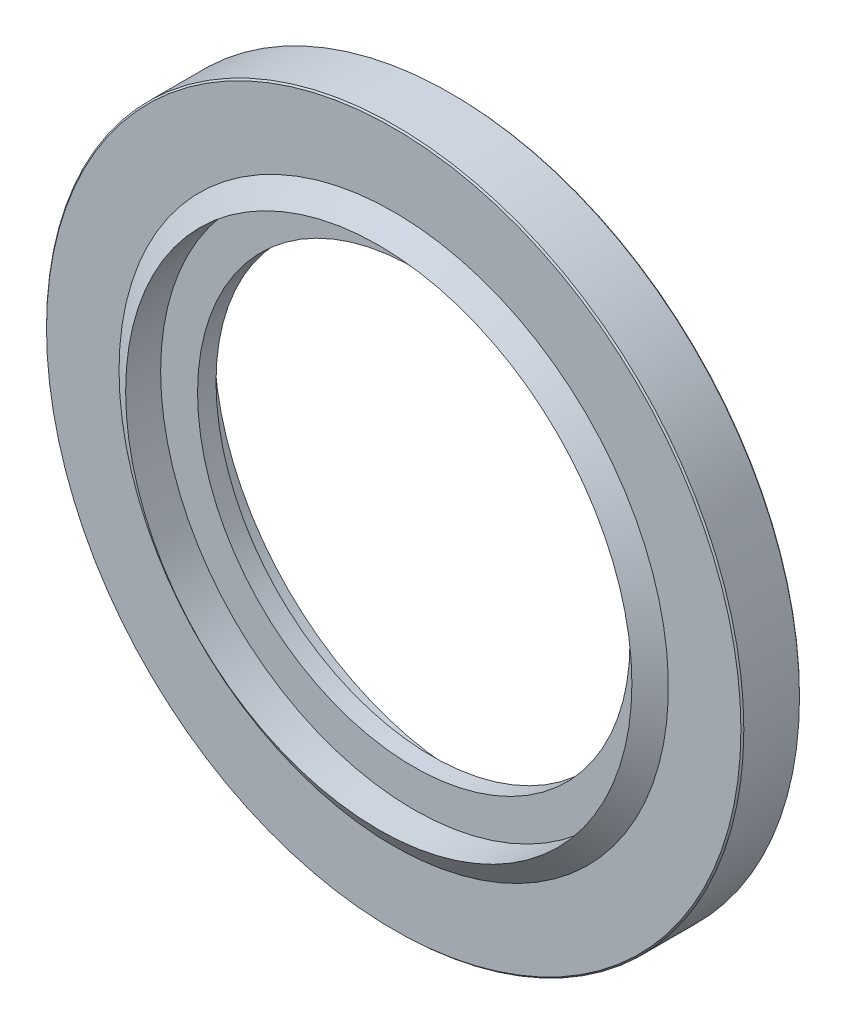
ISO-10303-21;
HEADER;
FILE_DESCRIPTION(('STEP AP214'),'2;1');
FILE_NAME('part.step','',(''),(''),'','','');
FILE_SCHEMA(('AUTOMOTIVE_DESIGN { 1 0 10303 214 1 1 1 1 }'));
ENDSEC;
DATA;
#1=APPLICATION_CONTEXT('core data for automotive mechanical design processes');
#2=APPLICATION_PROTOCOL_DEFINITION('international standard','automotive_design',2000,#1);
#3=PRODUCT_CONTEXT('',#1,'mechanical');
#4=PRODUCT('Part','Part','',(#3));
#5=PRODUCT_RELATED_PRODUCT_CATEGORY('part','',(#4));
#6=PRODUCT_DEFINITION_FORMATION('','',#4);
#7=PRODUCT_DEFINITION_CONTEXT('part definition',#1,'design');
#8=PRODUCT_DEFINITION('design','',#6,#7);
#9=PRODUCT_DEFINITION_SHAPE('','',#8);
#10=(LENGTH_UNIT() NAMED_UNIT(*) SI_UNIT(.MILLI.,.METRE.));
#11=(NAMED_UNIT(*) PLANE_ANGLE_UNIT() SI_UNIT($,.RADIAN.));
#12=(NAMED_UNIT(*) SI_UNIT($,.STERADIAN.) SOLID_ANGLE_UNIT());
#13=UNCERTAINTY_MEASURE_WITH_UNIT(LENGTH_MEASURE(1.E-05),#10,'distance_accuracy_value','');
#14=(GEOMETRIC_REPRESENTATION_CONTEXT(3) GLOBAL_UNCERTAINTY_ASSIGNED_CONTEXT((#13)) GLOBAL_UNIT_ASSIGNED_CONTEXT((#10,
#11,#12)) REPRESENTATION_CONTEXT('',''));
#15=CARTESIAN_POINT('',(0.,0.,0.));
#16=DIRECTION('',(0.,0.,1.));
#17=DIRECTION('',(1.,0.,0.));
#18=AXIS2_PLACEMENT_3D('',#15,#16,#17);
#19=CARTESIAN_POINT('',(0.,8.64,0.314999999999996));
#20=DIRECTION('',(0.,0.,-1.));
#21=DIRECTION('',(0.,-1.,0.));
#22=AXIS2_PLACEMENT_3D('',#19,#20,#21);
#23=PLANE('',#22);
#24=CARTESIAN_POINT('',(0.,0.,0.315));
#25=DIRECTION('',(0.,0.,1.));
#26=DIRECTION('',(1.,0.,0.));
#27=AXIS2_PLACEMENT_3D('',#24,#25,#26);
#28=CIRCLE('',#27,7.38);
#29=CARTESIAN_POINT('',(7.38,0.,0.315));
#30=VERTEX_POINT('',#29);
#31=EDGE_CURVE('E107',#30,#30,#28,.T.);
#32=ORIENTED_EDGE('',*,*,#31,.F.);
#33=EDGE_LOOP('',(#32));
#34=FACE_BOUND('',#33,.T.);
#35=CARTESIAN_POINT('',(0.,0.,0.314999999999994));
#36=DIRECTION('',(0.,0.,1.));
#37=DIRECTION('',(1.,0.,0.));
#38=AXIS2_PLACEMENT_3D('',#35,#36,#37);
#39=CIRCLE('',#38,8.64);
#40=CARTESIAN_POINT('',(8.64,0.,0.314999999999994));
#41=VERTEX_POINT('',#40);
#42=EDGE_CURVE('E112',#41,#41,#39,.T.);
#43=ORIENTED_EDGE('',*,*,#42,.T.);
#44=EDGE_LOOP('',(#43));
#45=FACE_BOUND('',#44,.T.);
#46=ADVANCED_FACE('F17',(#34,#45),#23,.F.);
#47=CARTESIAN_POINT('',(0.,8.64,-0.315000000000004));
#48=DIRECTION('',(0.,0.,1.));
#49=DIRECTION('',(1.,0.,0.));
#50=AXIS2_PLACEMENT_3D('',#47,#48,#49);
#51=PLANE('',#50);
#52=CARTESIAN_POINT('',(0.,0.,-0.315));
#53=DIRECTION('',(0.,0.,1.));
#54=DIRECTION('',(1.,0.,0.));
#55=AXIS2_PLACEMENT_3D('',#52,#53,#54);
#56=CIRCLE('',#55,7.38);
#57=CARTESIAN_POINT('',(7.38,0.,-0.315));
#58=VERTEX_POINT('',#57);
#59=EDGE_CURVE('E114',#58,#58,#56,.T.);
#60=ORIENTED_EDGE('',*,*,#59,.T.);
#61=EDGE_LOOP('',(#60));
#62=FACE_BOUND('',#61,.T.);
#63=CARTESIAN_POINT('',(0.,0.,-0.315000000000006));
#64=DIRECTION('',(0.,0.,1.));
#65=DIRECTION('',(1.,0.,0.));
#66=AXIS2_PLACEMENT_3D('',#63,#64,#65);
#67=CIRCLE('',#66,8.64);
#68=CARTESIAN_POINT('',(8.64,0.,-0.315000000000006));
#69=VERTEX_POINT('',#68);
#70=EDGE_CURVE('E100',#69,#69,#67,.T.);
#71=ORIENTED_EDGE('',*,*,#70,.F.);
#72=EDGE_LOOP('',(#71));
#73=FACE_BOUND('',#72,.T.);
#74=ADVANCED_FACE('F144',(#62,#73),#51,.F.);
#75=CARTESIAN_POINT('',(0.,11.9,1.));
#76=DIRECTION('',(0.,0.,-1.));
#77=DIRECTION('',(0.,-1.,0.));
#78=AXIS2_PLACEMENT_3D('',#75,#76,#77);
#79=PLANE('',#78);
#80=CARTESIAN_POINT('',(0.,0.,1.));
#81=DIRECTION('',(0.,0.,1.));
#82=DIRECTION('',(1.,0.,0.));
#83=AXIS2_PLACEMENT_3D('',#80,#81,#82);
#84=CIRCLE('',#83,9.375);
#85=CARTESIAN_POINT('',(-9.375,0.,1.));
#86=VERTEX_POINT('',#85);
#87=EDGE_CURVE('E110',#86,#86,#84,.T.);
#88=ORIENTED_EDGE('',*,*,#87,.F.);
#89=EDGE_LOOP('',(#88));
#90=FACE_BOUND('',#89,.T.);
#91=CARTESIAN_POINT('',(0.,0.,1.));
#92=DIRECTION('',(0.,0.,1.));
#93=DIRECTION('',(-1.,0.,0.));
#94=AXIS2_PLACEMENT_3D('',#91,#92,#93);
#95=CIRCLE('',#94,11.85);
#96=CARTESIAN_POINT('',(-11.85,0.,1.));
#97=VERTEX_POINT('',#96);
#98=EDGE_CURVE('E95',#97,#97,#95,.T.);
#99=ORIENTED_EDGE('',*,*,#98,.T.);
#100=EDGE_LOOP('',(#99));
#101=FACE_BOUND('',#100,.T.);
#102=ADVANCED_FACE('F96',(#90,#101),#79,.F.);
#103=CARTESIAN_POINT('',(0.,11.9,-1.));
#104=DIRECTION('',(0.,0.,1.));
#105=DIRECTION('',(1.,0.,0.));
#106=AXIS2_PLACEMENT_3D('',#103,#104,#105);
#107=PLANE('',#106);
#108=CARTESIAN_POINT('',(0.,0.,-1.));
#109=DIRECTION('',(0.,0.,1.));
#110=DIRECTION('',(1.,0.,0.));
#111=AXIS2_PLACEMENT_3D('',#108,#109,#110);
#112=CIRCLE('',#111,9.375);
#113=CARTESIAN_POINT('',(9.375,0.,-1.));
#114=VERTEX_POINT('',#113);
#115=EDGE_CURVE('E21',#114,#114,#112,.T.);
#116=ORIENTED_EDGE('',*,*,#115,.T.);
#117=EDGE_LOOP('',(#116));
#118=FACE_BOUND('',#117,.T.);
#119=CARTESIAN_POINT('',(0.,0.,-1.));
#120=DIRECTION('',(0.,0.,-1.));
#121=DIRECTION('',(1.,0.,0.));
#122=AXIS2_PLACEMENT_3D('',#119,#120,#121);
#123=CIRCLE('',#122,11.85);
#124=CARTESIAN_POINT('',(11.85,0.,-1.));
#125=VERTEX_POINT('',#124);
#126=EDGE_CURVE('E27',#125,#125,#123,.T.);
#127=ORIENTED_EDGE('',*,*,#126,.T.);
#128=EDGE_LOOP('',(#127));
#129=FACE_BOUND('',#128,.T.);
#130=ADVANCED_FACE('F207',(#118,#129),#107,.F.);
#131=CARTESIAN_POINT('',(0.,0.,2.06244122698623));
#132=DIRECTION('',(0.,0.,1.));
#133=DIRECTION('',(1.,0.,0.));
#134=AXIS2_PLACEMENT_3D('',#131,#132,#133);
#135=CYLINDRICAL_SURFACE('',#134,11.9);
#136=CARTESIAN_POINT('',(0.,0.,0.95));
#137=DIRECTION('',(0.,0.,-1.));
#138=DIRECTION('',(-1.,0.,0.));
#139=AXIS2_PLACEMENT_3D('',#136,#137,#138);
#140=CIRCLE('',#139,11.9);
#141=CARTESIAN_POINT('',(-11.9,0.,0.95));
#142=VERTEX_POINT('',#141);
#143=EDGE_CURVE('E99',#142,#142,#140,.T.);
#144=ORIENTED_EDGE('',*,*,#143,.T.);
#145=EDGE_LOOP('',(#144));
#146=FACE_BOUND('',#145,.T.);
#147=CARTESIAN_POINT('',(0.,0.,-0.95));
#148=DIRECTION('',(0.,0.,1.));
#149=DIRECTION('',(1.,0.,0.));
#150=AXIS2_PLACEMENT_3D('',#147,#148,#149);
#151=CIRCLE('',#150,11.9);
#152=CARTESIAN_POINT('',(11.9,0.,-0.95));
#153=VERTEX_POINT('',#152);
#154=EDGE_CURVE('E11',#153,#153,#151,.T.);
#155=ORIENTED_EDGE('',*,*,#154,.T.);
#156=EDGE_LOOP('',(#155));
#157=FACE_BOUND('',#156,.T.);
#158=ADVANCED_FACE('F19',(#146,#157),#135,.T.);
#159=CARTESIAN_POINT('',(0.,0.,-0.95));
#160=DIRECTION('',(0.,0.,1.));
#161=DIRECTION('',(1.,0.,0.));
#162=AXIS2_PLACEMENT_3D('',#159,#160,#161);
#163=CONICAL_SURFACE('',#162,11.9,0.785398163397466);
#164=ORIENTED_EDGE('',*,*,#154,.F.);
#165=EDGE_LOOP('',(#164));
#166=FACE_BOUND('',#165,.T.);
#167=ORIENTED_EDGE('',*,*,#126,.F.);
#168=EDGE_LOOP('',(#167));
#169=FACE_BOUND('',#168,.T.);
#170=ADVANCED_FACE('F180',(#166,#169),#163,.T.);
#171=CARTESIAN_POINT('',(0.,0.,1.));
#172=DIRECTION('',(0.,0.,-1.));
#173=DIRECTION('',(-1.,0.,0.));
#174=AXIS2_PLACEMENT_3D('',#171,#172,#173);
#175=CONICAL_SURFACE('',#174,11.85,0.785398163397448);
#176=ORIENTED_EDGE('',*,*,#143,.F.);
#177=EDGE_LOOP('',(#176));
#178=FACE_BOUND('',#177,.T.);
#179=ORIENTED_EDGE('',*,*,#98,.F.);
#180=EDGE_LOOP('',(#179));
#181=FACE_BOUND('',#180,.T.);
#182=ADVANCED_FACE('F185',(#178,#181),#175,.T.);
#183=CARTESIAN_POINT('',(0.,0.,2.48641304347825));
#184=DIRECTION('',(0.,0.,1.));
#185=DIRECTION('',(1.,0.,0.));
#186=AXIS2_PLACEMENT_3D('',#183,#184,#185);
#187=CYLINDRICAL_SURFACE('',#186,8.64);
#188=ORIENTED_EDGE('',*,*,#70,.T.);
#189=EDGE_LOOP('',(#188));
#190=FACE_BOUND('',#189,.T.);
#191=CARTESIAN_POINT('',(0.,0.,-1.51));
#192=DIRECTION('',(0.,0.,1.));
#193=DIRECTION('',(1.,0.,0.));
#194=AXIS2_PLACEMENT_3D('',#191,#192,#193);
#195=CIRCLE('',#194,8.64);
#196=CARTESIAN_POINT('',(-8.64,0.,-1.51));
#197=VERTEX_POINT('',#196);
#198=EDGE_CURVE('E72',#197,#197,#195,.T.);
#199=ORIENTED_EDGE('',*,*,#198,.F.);
#200=EDGE_LOOP('',(#199));
#201=FACE_BOUND('',#200,.T.);
#202=ADVANCED_FACE('F198',(#190,#201),#187,.F.);
#203=CARTESIAN_POINT('',(0.,0.,2.48641304347825));
#204=DIRECTION('',(0.,0.,1.));
#205=DIRECTION('',(1.,0.,0.));
#206=AXIS2_PLACEMENT_3D('',#203,#204,#205);
#207=CYLINDRICAL_SURFACE('',#206,7.38);
#208=ORIENTED_EDGE('',*,*,#31,.T.);
#209=EDGE_LOOP('',(#208));
#210=FACE_BOUND('',#209,.T.);
#211=ORIENTED_EDGE('',*,*,#59,.F.);
#212=EDGE_LOOP('',(#211));
#213=FACE_BOUND('',#212,.T.);
#214=ADVANCED_FACE('F222',(#210,#213),#207,.F.);
#215=CARTESIAN_POINT('',(0.,0.,2.48641304347825));
#216=DIRECTION('',(0.,0.,1.));
#217=DIRECTION('',(1.,0.,0.));
#218=AXIS2_PLACEMENT_3D('',#215,#216,#217);
#219=CYLINDRICAL_SURFACE('',#218,8.64);
#220=CARTESIAN_POINT('',(0.,0.,1.51));
#221=DIRECTION('',(0.,0.,1.));
#222=DIRECTION('',(1.,0.,0.));
#223=AXIS2_PLACEMENT_3D('',#220,#221,#222);
#224=CIRCLE('',#223,8.64);
#225=CARTESIAN_POINT('',(-8.64,0.,1.51));
#226=VERTEX_POINT('',#225);
#227=EDGE_CURVE('E113',#226,#226,#224,.T.);
#228=ORIENTED_EDGE('',*,*,#227,.T.);
#229=EDGE_LOOP('',(#228));
#230=FACE_BOUND('',#229,.T.);
#231=ORIENTED_EDGE('',*,*,#42,.F.);
#232=EDGE_LOOP('',(#231));
#233=FACE_BOUND('',#232,.T.);
#234=ADVANCED_FACE('F171',(#230,#233),#219,.F.);
#235=CARTESIAN_POINT('',(0.,0.,1.));
#236=DIRECTION('',(0.,0.,-1.));
#237=DIRECTION('',(-1.,0.,0.));
#238=AXIS2_PLACEMENT_3D('',#235,#236,#237);
#239=CONICAL_SURFACE('',#238,9.375,0.96419121820037);
#240=ORIENTED_EDGE('',*,*,#87,.T.);
#241=EDGE_LOOP('',(#240));
#242=FACE_BOUND('',#241,.T.);
#243=ORIENTED_EDGE('',*,*,#227,.F.);
#244=EDGE_LOOP('',(#243));
#245=FACE_BOUND('',#244,.T.);
#246=ADVANCED_FACE('F159',(#242,#245),#239,.T.);
#247=CARTESIAN_POINT('',(0.,0.,-1.51));
#248=DIRECTION('',(0.,0.,1.));
#249=DIRECTION('',(1.,0.,0.));
#250=AXIS2_PLACEMENT_3D('',#247,#248,#249);
#251=CONICAL_SURFACE('',#250,8.64,0.964191218200347);
#252=ORIENTED_EDGE('',*,*,#115,.F.);
#253=EDGE_LOOP('',(#252));
#254=FACE_BOUND('',#253,.T.);
#255=ORIENTED_EDGE('',*,*,#198,.T.);
#256=EDGE_LOOP('',(#255));
#257=FACE_BOUND('',#256,.T.);
#258=ADVANCED_FACE('F154',(#254,#257),#251,.T.);
#259=CLOSED_SHELL('',(#46,#74,#102,#130,#158,#170,#182,#202,#214,#234,#246,#258));
#260=MANIFOLD_SOLID_BREP('B1',#259);
#261=ADVANCED_BREP_SHAPE_REPRESENTATION('',(#18,#260),#14);
#262=SHAPE_DEFINITION_REPRESENTATION(#9,#261);
ENDSEC;
END-ISO-10303-21;
